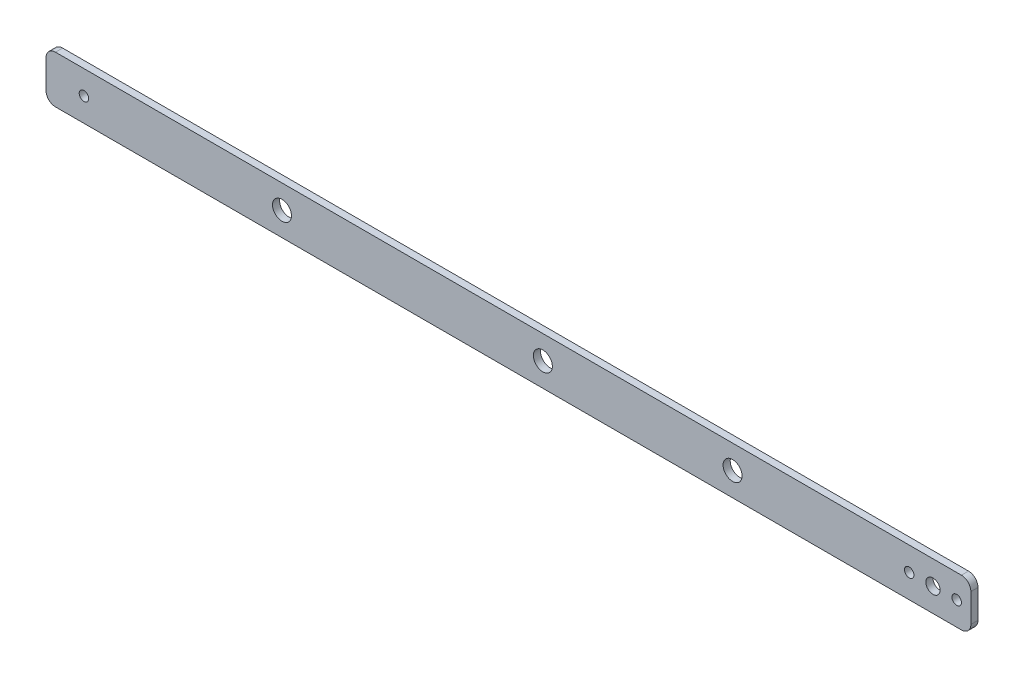
ISO-10303-21;
HEADER;
FILE_DESCRIPTION(('STEP AP214'),'2;1');
FILE_NAME('part.step','',(''),(''),'','','');
FILE_SCHEMA(('AUTOMOTIVE_DESIGN { 1 0 10303 214 1 1 1 1 }'));
ENDSEC;
DATA;
#1=APPLICATION_CONTEXT('core data for automotive mechanical design processes');
#2=APPLICATION_PROTOCOL_DEFINITION('international standard','automotive_design',2000,#1);
#3=PRODUCT_CONTEXT('',#1,'mechanical');
#4=PRODUCT('Part','Part','',(#3));
#5=PRODUCT_RELATED_PRODUCT_CATEGORY('part','',(#4));
#6=PRODUCT_DEFINITION_FORMATION('','',#4);
#7=PRODUCT_DEFINITION_CONTEXT('part definition',#1,'design');
#8=PRODUCT_DEFINITION('design','',#6,#7);
#9=PRODUCT_DEFINITION_SHAPE('','',#8);
#10=(LENGTH_UNIT() NAMED_UNIT(*) SI_UNIT(.MILLI.,.METRE.));
#11=(NAMED_UNIT(*) PLANE_ANGLE_UNIT() SI_UNIT($,.RADIAN.));
#12=(NAMED_UNIT(*) SI_UNIT($,.STERADIAN.) SOLID_ANGLE_UNIT());
#13=UNCERTAINTY_MEASURE_WITH_UNIT(LENGTH_MEASURE(1.E-05),#10,'distance_accuracy_value','');
#14=(GEOMETRIC_REPRESENTATION_CONTEXT(3) GLOBAL_UNCERTAINTY_ASSIGNED_CONTEXT((#13)) GLOBAL_UNIT_ASSIGNED_CONTEXT((#10,
#11,#12)) REPRESENTATION_CONTEXT('',''));
#15=CARTESIAN_POINT('',(0.,0.,0.));
#16=DIRECTION('',(0.,0.,1.));
#17=DIRECTION('',(1.,0.,0.));
#18=AXIS2_PLACEMENT_3D('',#15,#16,#17);
#19=CARTESIAN_POINT('',(0.,0.,1.5));
#20=DIRECTION('',(0.,0.,1.));
#21=DIRECTION('',(1.,0.,0.));
#22=AXIS2_PLACEMENT_3D('',#19,#20,#21);
#23=PLANE('',#22);
#24=CARTESIAN_POINT('',(-8.00000000000001,-5.00000000000011,1.5));
#25=DIRECTION('',(0.,0.,1.));
#26=DIRECTION('',(1.,0.,0.));
#27=AXIS2_PLACEMENT_3D('',#24,#25,#26);
#28=CIRCLE('',#27,1.);
#29=CARTESIAN_POINT('',(-7.,-5.00000000000011,1.5));
#30=VERTEX_POINT('',#29);
#31=EDGE_CURVE('E146',#30,#30,#28,.T.);
#32=ORIENTED_EDGE('',*,*,#31,.F.);
#33=EDGE_LOOP('',(#32));
#34=FACE_BOUND('',#33,.T.);
#35=CARTESIAN_POINT('',(-13.,-5.00000000000011,1.5));
#36=DIRECTION('',(0.,0.,1.));
#37=DIRECTION('',(1.,0.,0.));
#38=AXIS2_PLACEMENT_3D('',#35,#36,#37);
#39=CIRCLE('',#38,1.5);
#40=CARTESIAN_POINT('',(-11.5,-5.00000000000011,1.5));
#41=VERTEX_POINT('',#40);
#42=EDGE_CURVE('E210',#41,#41,#39,.T.);
#43=ORIENTED_EDGE('',*,*,#42,.F.);
#44=EDGE_LOOP('',(#43));
#45=FACE_BOUND('',#44,.T.);
#46=CARTESIAN_POINT('',(-18.,-5.00000000000011,1.5));
#47=DIRECTION('',(0.,0.,1.));
#48=DIRECTION('',(1.,0.,0.));
#49=AXIS2_PLACEMENT_3D('',#46,#47,#48);
#50=CIRCLE('',#49,0.999999999999998);
#51=CARTESIAN_POINT('',(-17.,-5.00000000000011,1.5));
#52=VERTEX_POINT('',#51);
#53=EDGE_CURVE('E207',#52,#52,#50,.T.);
#54=ORIENTED_EDGE('',*,*,#53,.F.);
#55=EDGE_LOOP('',(#54));
#56=FACE_BOUND('',#55,.T.);
#57=CARTESIAN_POINT('',(-192.,-5.00000000000011,1.5));
#58=DIRECTION('',(0.,0.,1.));
#59=DIRECTION('',(1.,0.,0.));
#60=AXIS2_PLACEMENT_3D('',#57,#58,#59);
#61=CIRCLE('',#60,0.999999999999998);
#62=CARTESIAN_POINT('',(-191.,-5.00000000000011,1.5));
#63=VERTEX_POINT('',#62);
#64=EDGE_CURVE('E140',#63,#63,#61,.F.);
#65=ORIENTED_EDGE('',*,*,#64,.T.);
#66=EDGE_LOOP('',(#65));
#67=FACE_BOUND('',#66,.T.);
#68=CARTESIAN_POINT('',(-95.2424749169345,-5.00000000204738,1.5));
#69=DIRECTION('',(0.,0.,1.));
#70=DIRECTION('',(1.,0.,0.));
#71=AXIS2_PLACEMENT_3D('',#68,#69,#70);
#72=CIRCLE('',#71,2.);
#73=CARTESIAN_POINT('',(-93.2424749169345,-5.00000000204738,1.5));
#74=VERTEX_POINT('',#73);
#75=EDGE_CURVE('E192',#74,#74,#72,.T.);
#76=ORIENTED_EDGE('',*,*,#75,.F.);
#77=EDGE_LOOP('',(#76));
#78=FACE_BOUND('',#77,.T.);
#79=DIRECTION('',(0.,1.,0.));
#80=VECTOR('',#79,1.);
#81=CARTESIAN_POINT('',(-5.,-1.11022302462516E-13,1.5));
#82=LINE('',#81,#80);
#83=CARTESIAN_POINT('',(-5.,-8.00000000000011,1.5));
#84=VERTEX_POINT('',#83);
#85=CARTESIAN_POINT('',(-5.,-2.00000000000011,1.5));
#86=VERTEX_POINT('',#85);
#87=EDGE_CURVE('E187',#84,#86,#82,.T.);
#88=ORIENTED_EDGE('',*,*,#87,.T.);
#89=CARTESIAN_POINT('',(-7.00000000000001,-2.00000000000011,1.5));
#90=DIRECTION('',(0.,0.,1.));
#91=DIRECTION('',(1.,0.,0.));
#92=AXIS2_PLACEMENT_3D('',#89,#90,#91);
#93=CIRCLE('',#92,2.);
#94=CARTESIAN_POINT('',(-7.00000000000001,-1.11013455629994E-13,1.5));
#95=VERTEX_POINT('',#94);
#96=EDGE_CURVE('E164',#86,#95,#93,.T.);
#97=ORIENTED_EDGE('',*,*,#96,.T.);
#98=DIRECTION('',(-1.,0.,0.));
#99=VECTOR('',#98,1.);
#100=CARTESIAN_POINT('',(-200.,-1.10159736291652E-13,1.5));
#101=LINE('',#100,#99);
#102=CARTESIAN_POINT('',(-198.,-1.10168583124173E-13,1.5));
#103=VERTEX_POINT('',#102);
#104=EDGE_CURVE('E121',#95,#103,#101,.T.);
#105=ORIENTED_EDGE('',*,*,#104,.T.);
#106=CARTESIAN_POINT('',(-198.,-2.00000000000011,1.5));
#107=DIRECTION('',(0.,0.,1.));
#108=DIRECTION('',(1.,0.,0.));
#109=AXIS2_PLACEMENT_3D('',#106,#107,#108);
#110=CIRCLE('',#109,2.);
#111=CARTESIAN_POINT('',(-200.,-2.00000000000011,1.5));
#112=VERTEX_POINT('',#111);
#113=EDGE_CURVE('E159',#103,#112,#110,.T.);
#114=ORIENTED_EDGE('',*,*,#113,.T.);
#115=DIRECTION('',(0.,-1.,0.));
#116=VECTOR('',#115,1.);
#117=CARTESIAN_POINT('',(-200.,-1.10159736291652E-13,1.5));
#118=LINE('',#117,#116);
#119=CARTESIAN_POINT('',(-200.,-8.00000000000011,1.5));
#120=VERTEX_POINT('',#119);
#121=EDGE_CURVE('E128',#112,#120,#118,.T.);
#122=ORIENTED_EDGE('',*,*,#121,.T.);
#123=CARTESIAN_POINT('',(-198.,-8.00000000000011,1.5));
#124=DIRECTION('',(0.,0.,1.));
#125=DIRECTION('',(1.,0.,0.));
#126=AXIS2_PLACEMENT_3D('',#123,#124,#125);
#127=CIRCLE('',#126,2.);
#128=CARTESIAN_POINT('',(-198.,-10.0000000000001,1.5));
#129=VERTEX_POINT('',#128);
#130=EDGE_CURVE('E57',#120,#129,#127,.T.);
#131=ORIENTED_EDGE('',*,*,#130,.T.);
#132=DIRECTION('',(1.,0.,0.));
#133=VECTOR('',#132,1.);
#134=CARTESIAN_POINT('',(-200.,-10.0000000000001,1.5));
#135=LINE('',#134,#133);
#136=CARTESIAN_POINT('',(-7.00000000000001,-10.0000000000001,1.5));
#137=VERTEX_POINT('',#136);
#138=EDGE_CURVE('E131',#129,#137,#135,.T.);
#139=ORIENTED_EDGE('',*,*,#138,.T.);
#140=CARTESIAN_POINT('',(-7.,-8.00000000000011,1.5));
#141=DIRECTION('',(0.,0.,1.));
#142=DIRECTION('',(1.,0.,0.));
#143=AXIS2_PLACEMENT_3D('',#140,#141,#142);
#144=CIRCLE('',#143,2.);
#145=EDGE_CURVE('E162',#137,#84,#144,.T.);
#146=ORIENTED_EDGE('',*,*,#145,.T.);
#147=EDGE_LOOP('',(#88,#97,#105,#114,#122,#131,#139,#146));
#148=FACE_BOUND('',#147,.T.);
#149=CARTESIAN_POINT('',(-55.2424749169345,-5.00000000204739,1.5));
#150=DIRECTION('',(0.,0.,1.));
#151=DIRECTION('',(1.,0.,0.));
#152=AXIS2_PLACEMENT_3D('',#149,#150,#151);
#153=CIRCLE('',#152,2.);
#154=CARTESIAN_POINT('',(-53.2424749169345,-5.00000000204739,1.5));
#155=VERTEX_POINT('',#154);
#156=EDGE_CURVE('E180',#155,#155,#153,.T.);
#157=ORIENTED_EDGE('',*,*,#156,.F.);
#158=EDGE_LOOP('',(#157));
#159=FACE_BOUND('',#158,.T.);
#160=CARTESIAN_POINT('',(-150.242474916935,-5.00000000204738,1.5));
#161=DIRECTION('',(0.,0.,1.));
#162=DIRECTION('',(1.,0.,0.));
#163=AXIS2_PLACEMENT_3D('',#160,#161,#162);
#164=CIRCLE('',#163,2.);
#165=CARTESIAN_POINT('',(-148.242474916935,-5.00000000204738,1.5));
#166=VERTEX_POINT('',#165);
#167=EDGE_CURVE('E197',#166,#166,#164,.T.);
#168=ORIENTED_EDGE('',*,*,#167,.F.);
#169=EDGE_LOOP('',(#168));
#170=FACE_BOUND('',#169,.T.);
#171=ADVANCED_FACE('F35',(#34,#45,#56,#67,#78,#148,#159,#170),#23,.T.);
#172=CARTESIAN_POINT('',(0.,0.,0.));
#173=DIRECTION('',(0.,0.,1.));
#174=DIRECTION('',(1.,0.,0.));
#175=AXIS2_PLACEMENT_3D('',#172,#173,#174);
#176=PLANE('',#175);
#177=CARTESIAN_POINT('',(-8.00000000000001,-5.00000000000011,0.));
#178=DIRECTION('',(0.,0.,1.));
#179=DIRECTION('',(1.,0.,0.));
#180=AXIS2_PLACEMENT_3D('',#177,#178,#179);
#181=CIRCLE('',#180,1.);
#182=CARTESIAN_POINT('',(-7.,-5.00000000000011,0.));
#183=VERTEX_POINT('',#182);
#184=EDGE_CURVE('E141',#183,#183,#181,.T.);
#185=ORIENTED_EDGE('',*,*,#184,.T.);
#186=EDGE_LOOP('',(#185));
#187=FACE_BOUND('',#186,.T.);
#188=CARTESIAN_POINT('',(-13.,-5.00000000000011,0.));
#189=DIRECTION('',(0.,0.,1.));
#190=DIRECTION('',(1.,0.,0.));
#191=AXIS2_PLACEMENT_3D('',#188,#189,#190);
#192=CIRCLE('',#191,1.5);
#193=CARTESIAN_POINT('',(-11.5,-5.00000000000011,0.));
#194=VERTEX_POINT('',#193);
#195=EDGE_CURVE('E145',#194,#194,#192,.T.);
#196=ORIENTED_EDGE('',*,*,#195,.T.);
#197=EDGE_LOOP('',(#196));
#198=FACE_BOUND('',#197,.T.);
#199=CARTESIAN_POINT('',(-18.,-5.00000000000011,0.));
#200=DIRECTION('',(0.,0.,1.));
#201=DIRECTION('',(1.,0.,0.));
#202=AXIS2_PLACEMENT_3D('',#199,#200,#201);
#203=CIRCLE('',#202,0.999999999999998);
#204=CARTESIAN_POINT('',(-17.,-5.00000000000011,0.));
#205=VERTEX_POINT('',#204);
#206=EDGE_CURVE('E142',#205,#205,#203,.T.);
#207=ORIENTED_EDGE('',*,*,#206,.T.);
#208=EDGE_LOOP('',(#207));
#209=FACE_BOUND('',#208,.T.);
#210=CARTESIAN_POINT('',(-192.,-5.00000000000011,0.));
#211=DIRECTION('',(0.,0.,1.));
#212=DIRECTION('',(1.,0.,0.));
#213=AXIS2_PLACEMENT_3D('',#210,#211,#212);
#214=CIRCLE('',#213,0.999999999999998);
#215=CARTESIAN_POINT('',(-191.,-5.00000000000011,0.));
#216=VERTEX_POINT('',#215);
#217=EDGE_CURVE('E137',#216,#216,#214,.F.);
#218=ORIENTED_EDGE('',*,*,#217,.F.);
#219=EDGE_LOOP('',(#218));
#220=FACE_BOUND('',#219,.T.);
#221=DIRECTION('',(-1.,0.,0.));
#222=VECTOR('',#221,1.);
#223=CARTESIAN_POINT('',(-200.,-1.10159736291652E-13,0.));
#224=LINE('',#223,#222);
#225=CARTESIAN_POINT('',(-7.00000000000001,-1.11013455629994E-13,0.));
#226=VERTEX_POINT('',#225);
#227=CARTESIAN_POINT('',(-198.,-1.10168583124173E-13,0.));
#228=VERTEX_POINT('',#227);
#229=EDGE_CURVE('E118',#226,#228,#224,.T.);
#230=ORIENTED_EDGE('',*,*,#229,.F.);
#231=CARTESIAN_POINT('',(-7.00000000000001,-2.00000000000011,0.));
#232=DIRECTION('',(0.,0.,1.));
#233=DIRECTION('',(1.,0.,0.));
#234=AXIS2_PLACEMENT_3D('',#231,#232,#233);
#235=CIRCLE('',#234,2.);
#236=CARTESIAN_POINT('',(-5.,-2.00000000000011,0.));
#237=VERTEX_POINT('',#236);
#238=EDGE_CURVE('E101',#226,#237,#235,.F.);
#239=ORIENTED_EDGE('',*,*,#238,.T.);
#240=DIRECTION('',(0.,1.,0.));
#241=VECTOR('',#240,1.);
#242=CARTESIAN_POINT('',(-5.,-1.11022302462516E-13,0.));
#243=LINE('',#242,#241);
#244=CARTESIAN_POINT('',(-5.,-8.00000000000011,0.));
#245=VERTEX_POINT('',#244);
#246=EDGE_CURVE('E129',#245,#237,#243,.T.);
#247=ORIENTED_EDGE('',*,*,#246,.F.);
#248=CARTESIAN_POINT('',(-7.,-8.00000000000011,0.));
#249=DIRECTION('',(0.,0.,1.));
#250=DIRECTION('',(1.,0.,0.));
#251=AXIS2_PLACEMENT_3D('',#248,#249,#250);
#252=CIRCLE('',#251,2.);
#253=CARTESIAN_POINT('',(-7.00000000000001,-10.0000000000001,0.));
#254=VERTEX_POINT('',#253);
#255=EDGE_CURVE('E112',#245,#254,#252,.F.);
#256=ORIENTED_EDGE('',*,*,#255,.T.);
#257=DIRECTION('',(1.,0.,0.));
#258=VECTOR('',#257,1.);
#259=CARTESIAN_POINT('',(-200.,-10.0000000000001,0.));
#260=LINE('',#259,#258);
#261=CARTESIAN_POINT('',(-198.,-10.0000000000001,0.));
#262=VERTEX_POINT('',#261);
#263=EDGE_CURVE('E133',#262,#254,#260,.T.);
#264=ORIENTED_EDGE('',*,*,#263,.F.);
#265=CARTESIAN_POINT('',(-198.,-8.00000000000011,0.));
#266=DIRECTION('',(0.,0.,1.));
#267=DIRECTION('',(1.,0.,0.));
#268=AXIS2_PLACEMENT_3D('',#265,#266,#267);
#269=CIRCLE('',#268,2.);
#270=CARTESIAN_POINT('',(-200.,-8.00000000000011,0.));
#271=VERTEX_POINT('',#270);
#272=EDGE_CURVE('E153',#262,#271,#269,.F.);
#273=ORIENTED_EDGE('',*,*,#272,.T.);
#274=DIRECTION('',(0.,-1.,0.));
#275=VECTOR('',#274,1.);
#276=CARTESIAN_POINT('',(-200.,-1.10159736291652E-13,0.));
#277=LINE('',#276,#275);
#278=CARTESIAN_POINT('',(-200.,-2.00000000000011,0.));
#279=VERTEX_POINT('',#278);
#280=EDGE_CURVE('E175',#279,#271,#277,.T.);
#281=ORIENTED_EDGE('',*,*,#280,.F.);
#282=CARTESIAN_POINT('',(-198.,-2.00000000000011,0.));
#283=DIRECTION('',(0.,0.,1.));
#284=DIRECTION('',(1.,0.,0.));
#285=AXIS2_PLACEMENT_3D('',#282,#283,#284);
#286=CIRCLE('',#285,2.);
#287=EDGE_CURVE('E122',#279,#228,#286,.F.);
#288=ORIENTED_EDGE('',*,*,#287,.T.);
#289=EDGE_LOOP('',(#230,#239,#247,#256,#264,#273,#281,#288));
#290=FACE_BOUND('',#289,.T.);
#291=CARTESIAN_POINT('',(-55.2424749169345,-5.00000000204739,0.));
#292=DIRECTION('',(0.,0.,1.));
#293=DIRECTION('',(1.,0.,0.));
#294=AXIS2_PLACEMENT_3D('',#291,#292,#293);
#295=CIRCLE('',#294,2.);
#296=CARTESIAN_POINT('',(-53.2424749169345,-5.00000000204739,0.));
#297=VERTEX_POINT('',#296);
#298=EDGE_CURVE('E183',#297,#297,#295,.T.);
#299=ORIENTED_EDGE('',*,*,#298,.T.);
#300=EDGE_LOOP('',(#299));
#301=FACE_BOUND('',#300,.T.);
#302=CARTESIAN_POINT('',(-95.2424749169345,-5.00000000204738,0.));
#303=DIRECTION('',(0.,0.,1.));
#304=DIRECTION('',(1.,0.,0.));
#305=AXIS2_PLACEMENT_3D('',#302,#303,#304);
#306=CIRCLE('',#305,2.);
#307=CARTESIAN_POINT('',(-93.2424749169345,-5.00000000204738,0.));
#308=VERTEX_POINT('',#307);
#309=EDGE_CURVE('E194',#308,#308,#306,.T.);
#310=ORIENTED_EDGE('',*,*,#309,.T.);
#311=EDGE_LOOP('',(#310));
#312=FACE_BOUND('',#311,.T.);
#313=CARTESIAN_POINT('',(-150.242474916935,-5.00000000204738,0.));
#314=DIRECTION('',(0.,0.,1.));
#315=DIRECTION('',(1.,0.,0.));
#316=AXIS2_PLACEMENT_3D('',#313,#314,#315);
#317=CIRCLE('',#316,2.);
#318=CARTESIAN_POINT('',(-148.242474916935,-5.00000000204738,0.));
#319=VERTEX_POINT('',#318);
#320=EDGE_CURVE('E200',#319,#319,#317,.T.);
#321=ORIENTED_EDGE('',*,*,#320,.T.);
#322=EDGE_LOOP('',(#321));
#323=FACE_BOUND('',#322,.T.);
#324=ADVANCED_FACE('F125',(#187,#198,#209,#220,#290,#301,#312,#323),#176,.F.);
#325=CARTESIAN_POINT('',(-200.,-1.10159736291652E-13,1.5));
#326=DIRECTION('',(1.,0.,0.));
#327=DIRECTION('',(0.,0.,-1.));
#328=AXIS2_PLACEMENT_3D('',#325,#326,#327);
#329=PLANE('',#328);
#330=ORIENTED_EDGE('',*,*,#280,.T.);
#331=DIRECTION('',(0.,0.,-1.));
#332=VECTOR('',#331,1.);
#333=CARTESIAN_POINT('',(-200.,-8.00000000000011,1.5));
#334=LINE('',#333,#332);
#335=EDGE_CURVE('E11',#271,#120,#334,.F.);
#336=ORIENTED_EDGE('',*,*,#335,.T.);
#337=ORIENTED_EDGE('',*,*,#121,.F.);
#338=DIRECTION('',(0.,0.,-1.));
#339=VECTOR('',#338,1.);
#340=CARTESIAN_POINT('',(-200.,-2.00000000000011,1.5));
#341=LINE('',#340,#339);
#342=EDGE_CURVE('E43',#112,#279,#341,.T.);
#343=ORIENTED_EDGE('',*,*,#342,.T.);
#344=EDGE_LOOP('',(#330,#336,#337,#343));
#345=FACE_BOUND('',#344,.T.);
#346=ADVANCED_FACE('F174',(#345),#329,.F.);
#347=CARTESIAN_POINT('',(-200.,-10.0000000000001,1.5));
#348=DIRECTION('',(0.,1.,0.));
#349=DIRECTION('',(0.,0.,1.));
#350=AXIS2_PLACEMENT_3D('',#347,#348,#349);
#351=PLANE('',#350);
#352=ORIENTED_EDGE('',*,*,#263,.T.);
#353=DIRECTION('',(0.,0.,-1.));
#354=VECTOR('',#353,1.);
#355=CARTESIAN_POINT('',(-7.00000000000001,-10.0000000000001,1.5));
#356=LINE('',#355,#354);
#357=EDGE_CURVE('E50',#254,#137,#356,.F.);
#358=ORIENTED_EDGE('',*,*,#357,.T.);
#359=ORIENTED_EDGE('',*,*,#138,.F.);
#360=DIRECTION('',(0.,0.,-1.));
#361=VECTOR('',#360,1.);
#362=CARTESIAN_POINT('',(-198.,-10.0000000000001,1.5));
#363=LINE('',#362,#361);
#364=EDGE_CURVE('E166',#129,#262,#363,.T.);
#365=ORIENTED_EDGE('',*,*,#364,.T.);
#366=EDGE_LOOP('',(#352,#358,#359,#365));
#367=FACE_BOUND('',#366,.T.);
#368=ADVANCED_FACE('F249',(#367),#351,.F.);
#369=CARTESIAN_POINT('',(-5.,-1.11022302462516E-13,1.5));
#370=DIRECTION('',(-1.,0.,0.));
#371=DIRECTION('',(0.,0.,1.));
#372=AXIS2_PLACEMENT_3D('',#369,#370,#371);
#373=PLANE('',#372);
#374=ORIENTED_EDGE('',*,*,#246,.T.);
#375=DIRECTION('',(0.,0.,-1.));
#376=VECTOR('',#375,1.);
#377=CARTESIAN_POINT('',(-5.,-2.00000000000011,1.5));
#378=LINE('',#377,#376);
#379=EDGE_CURVE('E106',#237,#86,#378,.F.);
#380=ORIENTED_EDGE('',*,*,#379,.T.);
#381=ORIENTED_EDGE('',*,*,#87,.F.);
#382=DIRECTION('',(0.,0.,-1.));
#383=VECTOR('',#382,1.);
#384=CARTESIAN_POINT('',(-5.,-8.00000000000011,1.5));
#385=LINE('',#384,#383);
#386=EDGE_CURVE('E111',#84,#245,#385,.T.);
#387=ORIENTED_EDGE('',*,*,#386,.T.);
#388=EDGE_LOOP('',(#374,#380,#381,#387));
#389=FACE_BOUND('',#388,.T.);
#390=ADVANCED_FACE('F257',(#389),#373,.F.);
#391=CARTESIAN_POINT('',(-200.,-1.10159736291652E-13,1.5));
#392=DIRECTION('',(0.,-1.,0.));
#393=DIRECTION('',(1.,0.,0.));
#394=AXIS2_PLACEMENT_3D('',#391,#392,#393);
#395=PLANE('',#394);
#396=ORIENTED_EDGE('',*,*,#104,.F.);
#397=DIRECTION('',(0.,0.,-1.));
#398=VECTOR('',#397,1.);
#399=CARTESIAN_POINT('',(-7.00000000000001,-1.11013455629994E-13,1.5));
#400=LINE('',#399,#398);
#401=EDGE_CURVE('E105',#95,#226,#400,.T.);
#402=ORIENTED_EDGE('',*,*,#401,.T.);
#403=ORIENTED_EDGE('',*,*,#229,.T.);
#404=DIRECTION('',(0.,0.,-1.));
#405=VECTOR('',#404,1.);
#406=CARTESIAN_POINT('',(-198.,-1.10168583124173E-13,1.5));
#407=LINE('',#406,#405);
#408=EDGE_CURVE('E123',#228,#103,#407,.F.);
#409=ORIENTED_EDGE('',*,*,#408,.T.);
#410=EDGE_LOOP('',(#396,#402,#403,#409));
#411=FACE_BOUND('',#410,.T.);
#412=ADVANCED_FACE('F117',(#411),#395,.F.);
#413=CARTESIAN_POINT('',(-55.2424749169345,-5.00000000204739,1.5));
#414=DIRECTION('',(0.,0.,-1.));
#415=DIRECTION('',(-1.,0.,0.));
#416=AXIS2_PLACEMENT_3D('',#413,#414,#415);
#417=CYLINDRICAL_SURFACE('',#416,2.);
#418=ORIENTED_EDGE('',*,*,#156,.T.);
#419=EDGE_LOOP('',(#418));
#420=FACE_BOUND('',#419,.T.);
#421=ORIENTED_EDGE('',*,*,#298,.F.);
#422=EDGE_LOOP('',(#421));
#423=FACE_BOUND('',#422,.T.);
#424=ADVANCED_FACE('F256',(#420,#423),#417,.F.);
#425=CARTESIAN_POINT('',(-95.2424749169345,-5.00000000204738,1.5));
#426=DIRECTION('',(0.,0.,-1.));
#427=DIRECTION('',(-1.,0.,0.));
#428=AXIS2_PLACEMENT_3D('',#425,#426,#427);
#429=CYLINDRICAL_SURFACE('',#428,2.);
#430=ORIENTED_EDGE('',*,*,#75,.T.);
#431=EDGE_LOOP('',(#430));
#432=FACE_BOUND('',#431,.T.);
#433=ORIENTED_EDGE('',*,*,#309,.F.);
#434=EDGE_LOOP('',(#433));
#435=FACE_BOUND('',#434,.T.);
#436=ADVANCED_FACE('F239',(#432,#435),#429,.F.);
#437=CARTESIAN_POINT('',(-150.242474916935,-5.00000000204738,1.5));
#438=DIRECTION('',(0.,0.,-1.));
#439=DIRECTION('',(-1.,0.,0.));
#440=AXIS2_PLACEMENT_3D('',#437,#438,#439);
#441=CYLINDRICAL_SURFACE('',#440,2.);
#442=ORIENTED_EDGE('',*,*,#167,.T.);
#443=EDGE_LOOP('',(#442));
#444=FACE_BOUND('',#443,.T.);
#445=ORIENTED_EDGE('',*,*,#320,.F.);
#446=EDGE_LOOP('',(#445));
#447=FACE_BOUND('',#446,.T.);
#448=ADVANCED_FACE('F235',(#444,#447),#441,.F.);
#449=CARTESIAN_POINT('',(-192.,-5.00000000000011,13.5));
#450=DIRECTION('',(0.,0.,-1.));
#451=DIRECTION('',(-1.,0.,0.));
#452=AXIS2_PLACEMENT_3D('',#449,#450,#451);
#453=CYLINDRICAL_SURFACE('',#452,0.999999999999998);
#454=ORIENTED_EDGE('',*,*,#64,.F.);
#455=EDGE_LOOP('',(#454));
#456=FACE_BOUND('',#455,.T.);
#457=ORIENTED_EDGE('',*,*,#217,.T.);
#458=EDGE_LOOP('',(#457));
#459=FACE_BOUND('',#458,.T.);
#460=ADVANCED_FACE('F238',(#456,#459),#453,.F.);
#461=CARTESIAN_POINT('',(-18.,-5.00000000000011,-8.5));
#462=DIRECTION('',(0.,0.,1.));
#463=DIRECTION('',(1.,0.,0.));
#464=AXIS2_PLACEMENT_3D('',#461,#462,#463);
#465=CYLINDRICAL_SURFACE('',#464,0.999999999999998);
#466=ORIENTED_EDGE('',*,*,#53,.T.);
#467=EDGE_LOOP('',(#466));
#468=FACE_BOUND('',#467,.T.);
#469=ORIENTED_EDGE('',*,*,#206,.F.);
#470=EDGE_LOOP('',(#469));
#471=FACE_BOUND('',#470,.T.);
#472=ADVANCED_FACE('F349',(#468,#471),#465,.F.);
#473=CARTESIAN_POINT('',(-13.,-5.00000000000011,-8.5));
#474=DIRECTION('',(0.,0.,1.));
#475=DIRECTION('',(1.,0.,0.));
#476=AXIS2_PLACEMENT_3D('',#473,#474,#475);
#477=CYLINDRICAL_SURFACE('',#476,1.5);
#478=ORIENTED_EDGE('',*,*,#42,.T.);
#479=EDGE_LOOP('',(#478));
#480=FACE_BOUND('',#479,.T.);
#481=ORIENTED_EDGE('',*,*,#195,.F.);
#482=EDGE_LOOP('',(#481));
#483=FACE_BOUND('',#482,.T.);
#484=ADVANCED_FACE('F340',(#480,#483),#477,.F.);
#485=CARTESIAN_POINT('',(-8.00000000000001,-5.00000000000011,-8.5));
#486=DIRECTION('',(0.,0.,1.));
#487=DIRECTION('',(1.,0.,0.));
#488=AXIS2_PLACEMENT_3D('',#485,#486,#487);
#489=CYLINDRICAL_SURFACE('',#488,1.);
#490=ORIENTED_EDGE('',*,*,#31,.T.);
#491=EDGE_LOOP('',(#490));
#492=FACE_BOUND('',#491,.T.);
#493=ORIENTED_EDGE('',*,*,#184,.F.);
#494=EDGE_LOOP('',(#493));
#495=FACE_BOUND('',#494,.T.);
#496=ADVANCED_FACE('F216',(#492,#495),#489,.F.);
#497=CARTESIAN_POINT('',(-7.00000000000001,-2.00000000000011,1.5));
#498=DIRECTION('',(0.,0.,-1.));
#499=DIRECTION('',(-1.,0.,0.));
#500=AXIS2_PLACEMENT_3D('',#497,#498,#499);
#501=CYLINDRICAL_SURFACE('',#500,2.);
#502=ORIENTED_EDGE('',*,*,#96,.F.);
#503=ORIENTED_EDGE('',*,*,#379,.F.);
#504=ORIENTED_EDGE('',*,*,#238,.F.);
#505=ORIENTED_EDGE('',*,*,#401,.F.);
#506=EDGE_LOOP('',(#502,#503,#504,#505));
#507=FACE_BOUND('',#506,.T.);
#508=ADVANCED_FACE('F104',(#507),#501,.T.);
#509=CARTESIAN_POINT('',(-7.,-8.00000000000011,1.5));
#510=DIRECTION('',(0.,0.,-1.));
#511=DIRECTION('',(-1.,0.,0.));
#512=AXIS2_PLACEMENT_3D('',#509,#510,#511);
#513=CYLINDRICAL_SURFACE('',#512,2.);
#514=ORIENTED_EDGE('',*,*,#145,.F.);
#515=ORIENTED_EDGE('',*,*,#357,.F.);
#516=ORIENTED_EDGE('',*,*,#255,.F.);
#517=ORIENTED_EDGE('',*,*,#386,.F.);
#518=EDGE_LOOP('',(#514,#515,#516,#517));
#519=FACE_BOUND('',#518,.T.);
#520=ADVANCED_FACE('F265',(#519),#513,.T.);
#521=CARTESIAN_POINT('',(-198.,-8.00000000000011,1.5));
#522=DIRECTION('',(0.,0.,-1.));
#523=DIRECTION('',(-1.,0.,0.));
#524=AXIS2_PLACEMENT_3D('',#521,#522,#523);
#525=CYLINDRICAL_SURFACE('',#524,2.);
#526=ORIENTED_EDGE('',*,*,#130,.F.);
#527=ORIENTED_EDGE('',*,*,#335,.F.);
#528=ORIENTED_EDGE('',*,*,#272,.F.);
#529=ORIENTED_EDGE('',*,*,#364,.F.);
#530=EDGE_LOOP('',(#526,#527,#528,#529));
#531=FACE_BOUND('',#530,.T.);
#532=ADVANCED_FACE('F267',(#531),#525,.T.);
#533=CARTESIAN_POINT('',(-198.,-2.00000000000011,1.5));
#534=DIRECTION('',(0.,0.,-1.));
#535=DIRECTION('',(-1.,0.,0.));
#536=AXIS2_PLACEMENT_3D('',#533,#534,#535);
#537=CYLINDRICAL_SURFACE('',#536,2.);
#538=ORIENTED_EDGE('',*,*,#113,.F.);
#539=ORIENTED_EDGE('',*,*,#408,.F.);
#540=ORIENTED_EDGE('',*,*,#287,.F.);
#541=ORIENTED_EDGE('',*,*,#342,.F.);
#542=EDGE_LOOP('',(#538,#539,#540,#541));
#543=FACE_BOUND('',#542,.T.);
#544=ADVANCED_FACE('F37',(#543),#537,.T.);
#545=CLOSED_SHELL('',(#171,#324,#346,#368,#390,#412,#424,#436,#448,#460,#472,#484,#496,#508,
#520,#532,#544));
#546=MANIFOLD_SOLID_BREP('B2',#545);
#547=ADVANCED_BREP_SHAPE_REPRESENTATION('',(#18,#546),#14);
#548=SHAPE_DEFINITION_REPRESENTATION(#9,#547);
ENDSEC;
END-ISO-10303-21;
